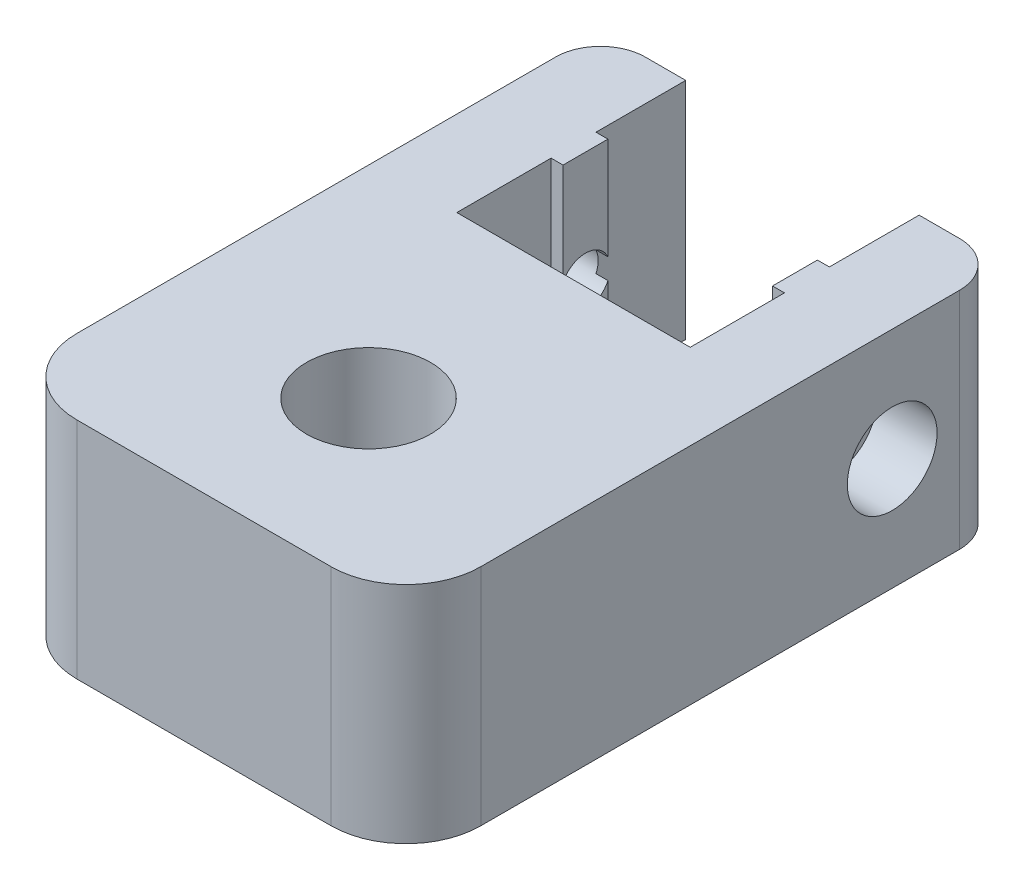
ISO-10303-21;
HEADER;
FILE_DESCRIPTION(('STEP AP214'),'2;1');
FILE_NAME('part.step','',(''),(''),'','','');
FILE_SCHEMA(('AUTOMOTIVE_DESIGN { 1 0 10303 214 1 1 1 1 }'));
ENDSEC;
DATA;
#1=APPLICATION_CONTEXT('core data for automotive mechanical design processes');
#2=APPLICATION_PROTOCOL_DEFINITION('international standard','automotive_design',2000,#1);
#3=PRODUCT_CONTEXT('',#1,'mechanical');
#4=PRODUCT('Part','Part','',(#3));
#5=PRODUCT_RELATED_PRODUCT_CATEGORY('part','',(#4));
#6=PRODUCT_DEFINITION_FORMATION('','',#4);
#7=PRODUCT_DEFINITION_CONTEXT('part definition',#1,'design');
#8=PRODUCT_DEFINITION('design','',#6,#7);
#9=PRODUCT_DEFINITION_SHAPE('','',#8);
#10=(LENGTH_UNIT() NAMED_UNIT(*) SI_UNIT(.MILLI.,.METRE.));
#11=(NAMED_UNIT(*) PLANE_ANGLE_UNIT() SI_UNIT($,.RADIAN.));
#12=(NAMED_UNIT(*) SI_UNIT($,.STERADIAN.) SOLID_ANGLE_UNIT());
#13=UNCERTAINTY_MEASURE_WITH_UNIT(LENGTH_MEASURE(1.E-05),#10,'distance_accuracy_value','');
#14=(GEOMETRIC_REPRESENTATION_CONTEXT(3) GLOBAL_UNCERTAINTY_ASSIGNED_CONTEXT((#13)) GLOBAL_UNIT_ASSIGNED_CONTEXT((#10,
#11,#12)) REPRESENTATION_CONTEXT('',''));
#15=CARTESIAN_POINT('',(0.,0.,0.));
#16=DIRECTION('',(0.,0.,1.));
#17=DIRECTION('',(1.,0.,0.));
#18=AXIS2_PLACEMENT_3D('',#15,#16,#17);
#19=CARTESIAN_POINT('',(64.,95.,79.5));
#20=DIRECTION('',(-1.,0.,0.));
#21=DIRECTION('',(0.,0.,1.));
#22=AXIS2_PLACEMENT_3D('',#19,#20,#21);
#23=PLANE('',#22);
#24=DIRECTION('',(0.,0.,1.));
#25=VECTOR('',#24,1.);
#26=CARTESIAN_POINT('',(64.,110.,79.5));
#27=LINE('',#26,#25);
#28=CARTESIAN_POINT('',(64.,110.,62.5));
#29=VERTEX_POINT('',#28);
#30=CARTESIAN_POINT('',(64.,110.,94.5));
#31=VERTEX_POINT('',#30);
#32=EDGE_CURVE('E398',#29,#31,#27,.T.);
#33=ORIENTED_EDGE('',*,*,#32,.F.);
#34=DIRECTION('',(0.,1.,0.));
#35=VECTOR('',#34,1.);
#36=CARTESIAN_POINT('',(64.,95.,62.5));
#37=LINE('',#36,#35);
#38=CARTESIAN_POINT('',(64.,95.,62.5));
#39=VERTEX_POINT('',#38);
#40=EDGE_CURVE('E363',#29,#39,#37,.F.);
#41=ORIENTED_EDGE('',*,*,#40,.T.);
#42=DIRECTION('',(0.,0.,1.));
#43=VECTOR('',#42,1.);
#44=CARTESIAN_POINT('',(64.,95.,79.5));
#45=LINE('',#44,#43);
#46=CARTESIAN_POINT('',(64.,95.,94.5));
#47=VERTEX_POINT('',#46);
#48=EDGE_CURVE('E503',#39,#47,#45,.T.);
#49=ORIENTED_EDGE('',*,*,#48,.T.);
#50=DIRECTION('',(0.,1.,0.));
#51=VECTOR('',#50,1.);
#52=CARTESIAN_POINT('',(64.,110.,94.5));
#53=LINE('',#52,#51);
#54=EDGE_CURVE('E324',#47,#31,#53,.T.);
#55=ORIENTED_EDGE('',*,*,#54,.T.);
#56=EDGE_LOOP('',(#33,#41,#49,#55));
#57=FACE_BOUND('',#56,.T.);
#58=CARTESIAN_POINT('',(64.,102.5,67.));
#59=DIRECTION('',(1.,0.,0.));
#60=DIRECTION('',(0.,0.,1.));
#61=AXIS2_PLACEMENT_3D('',#58,#59,#60);
#62=CIRCLE('',#61,3.);
#63=CARTESIAN_POINT('',(64.,102.5,70.));
#64=VERTEX_POINT('',#63);
#65=EDGE_CURVE('E743',#64,#64,#62,.T.);
#66=ORIENTED_EDGE('',*,*,#65,.T.);
#67=EDGE_LOOP('',(#66));
#68=FACE_BOUND('',#67,.T.);
#69=ADVANCED_FACE('F16',(#57,#68),#23,.T.);
#70=CARTESIAN_POINT('',(91.002,102.5,67.));
#71=DIRECTION('',(-1.,0.,0.));
#72=DIRECTION('',(0.,0.,1.));
#73=AXIS2_PLACEMENT_3D('',#70,#71,#72);
#74=CYLINDRICAL_SURFACE('',#73,1.65);
#75=CARTESIAN_POINT('',(69.7,102.5,67.));
#76=DIRECTION('',(-1.,0.,0.));
#77=DIRECTION('',(0.,0.,1.));
#78=AXIS2_PLACEMENT_3D('',#75,#76,#77);
#79=CIRCLE('',#78,1.65);
#80=CARTESIAN_POINT('',(69.7,103.187386354243,68.5));
#81=VERTEX_POINT('',#80);
#82=CARTESIAN_POINT('',(69.7,101.812613645757,68.5));
#83=VERTEX_POINT('',#82);
#84=EDGE_CURVE('E568',#81,#83,#79,.F.);
#85=ORIENTED_EDGE('',*,*,#84,.T.);
#86=DIRECTION('',(-1.,0.,0.));
#87=VECTOR('',#86,1.);
#88=CARTESIAN_POINT('',(91.002,101.812613645757,68.5));
#89=LINE('',#88,#87);
#90=CARTESIAN_POINT('',(70.5,101.812613645757,68.5));
#91=VERTEX_POINT('',#90);
#92=EDGE_CURVE('E565',#83,#91,#89,.F.);
#93=ORIENTED_EDGE('',*,*,#92,.T.);
#94=CARTESIAN_POINT('',(70.5,102.5,67.));
#95=DIRECTION('',(1.,0.,0.));
#96=DIRECTION('',(0.,0.,-1.));
#97=AXIS2_PLACEMENT_3D('',#94,#95,#96);
#98=CIRCLE('',#97,1.65);
#99=CARTESIAN_POINT('',(70.5,101.812613645757,65.5));
#100=VERTEX_POINT('',#99);
#101=EDGE_CURVE('E559',#100,#91,#98,.F.);
#102=ORIENTED_EDGE('',*,*,#101,.F.);
#103=DIRECTION('',(-1.,0.,0.));
#104=VECTOR('',#103,1.);
#105=CARTESIAN_POINT('',(91.002,101.812613645757,65.5));
#106=LINE('',#105,#104);
#107=CARTESIAN_POINT('',(69.7,101.812613645757,65.5));
#108=VERTEX_POINT('',#107);
#109=EDGE_CURVE('E268',#108,#100,#106,.F.);
#110=ORIENTED_EDGE('',*,*,#109,.F.);
#111=CARTESIAN_POINT('',(69.7,102.5,67.));
#112=DIRECTION('',(-1.,0.,0.));
#113=DIRECTION('',(0.,0.,1.));
#114=AXIS2_PLACEMENT_3D('',#111,#112,#113);
#115=CIRCLE('',#114,1.65);
#116=CARTESIAN_POINT('',(69.7,103.187386354243,65.5));
#117=VERTEX_POINT('',#116);
#118=EDGE_CURVE('E261',#108,#117,#115,.F.);
#119=ORIENTED_EDGE('',*,*,#118,.T.);
#120=DIRECTION('',(-1.,0.,0.));
#121=VECTOR('',#120,1.);
#122=CARTESIAN_POINT('',(91.002,103.187386354243,65.5));
#123=LINE('',#122,#121);
#124=CARTESIAN_POINT('',(70.5,103.187386354243,65.5));
#125=VERTEX_POINT('',#124);
#126=EDGE_CURVE('E265',#125,#117,#123,.T.);
#127=ORIENTED_EDGE('',*,*,#126,.F.);
#128=CARTESIAN_POINT('',(70.5,103.187386354243,68.5));
#129=VERTEX_POINT('',#128);
#130=EDGE_CURVE('E555',#129,#125,#98,.F.);
#131=ORIENTED_EDGE('',*,*,#130,.F.);
#132=DIRECTION('',(-1.,0.,0.));
#133=VECTOR('',#132,1.);
#134=CARTESIAN_POINT('',(91.002,103.187386354243,68.5));
#135=LINE('',#134,#133);
#136=EDGE_CURVE('E562',#129,#81,#135,.T.);
#137=ORIENTED_EDGE('',*,*,#136,.T.);
#138=EDGE_LOOP('',(#85,#93,#102,#110,#119,#127,#131,#137));
#139=FACE_BOUND('',#138,.T.);
#140=CARTESIAN_POINT('',(66.,102.5,67.));
#141=DIRECTION('',(1.,0.,0.));
#142=DIRECTION('',(0.,0.,1.));
#143=AXIS2_PLACEMENT_3D('',#140,#141,#142);
#144=CIRCLE('',#143,1.65);
#145=CARTESIAN_POINT('',(66.,102.5,68.65));
#146=VERTEX_POINT('',#145);
#147=EDGE_CURVE('E728',#146,#146,#144,.T.);
#148=ORIENTED_EDGE('',*,*,#147,.F.);
#149=EDGE_LOOP('',(#148));
#150=FACE_BOUND('',#149,.T.);
#151=ADVANCED_FACE('F263',(#139,#150),#74,.F.);
#152=DIRECTION('',(-1.,0.,0.));
#153=VECTOR('',#152,1.);
#154=CARTESIAN_POINT('',(91.002,101.812613645757,65.5));
#155=LINE('',#154,#153);
#156=CARTESIAN_POINT('',(84.5,101.812613645757,65.5));
#157=VERTEX_POINT('',#156);
#158=CARTESIAN_POINT('',(85.3,101.812613645757,65.5));
#159=VERTEX_POINT('',#158);
#160=EDGE_CURVE('E587',#157,#159,#155,.F.);
#161=ORIENTED_EDGE('',*,*,#160,.F.);
#162=CARTESIAN_POINT('',(84.5,102.5,67.));
#163=DIRECTION('',(1.,0.,0.));
#164=DIRECTION('',(0.,0.,-1.));
#165=AXIS2_PLACEMENT_3D('',#162,#163,#164);
#166=CIRCLE('',#165,1.65);
#167=CARTESIAN_POINT('',(84.5,101.812613645757,68.5));
#168=VERTEX_POINT('',#167);
#169=EDGE_CURVE('E584',#157,#168,#166,.F.);
#170=ORIENTED_EDGE('',*,*,#169,.T.);
#171=DIRECTION('',(-1.,0.,0.));
#172=VECTOR('',#171,1.);
#173=CARTESIAN_POINT('',(91.002,101.812613645757,68.5));
#174=LINE('',#173,#172);
#175=CARTESIAN_POINT('',(85.3,101.812613645757,68.5));
#176=VERTEX_POINT('',#175);
#177=EDGE_CURVE('E578',#168,#176,#174,.F.);
#178=ORIENTED_EDGE('',*,*,#177,.T.);
#179=CARTESIAN_POINT('',(85.3,102.5,67.));
#180=DIRECTION('',(-1.,0.,0.));
#181=DIRECTION('',(0.,0.,1.));
#182=AXIS2_PLACEMENT_3D('',#179,#180,#181);
#183=CIRCLE('',#182,1.65);
#184=CARTESIAN_POINT('',(85.3,103.187386354243,68.5));
#185=VERTEX_POINT('',#184);
#186=EDGE_CURVE('E571',#185,#176,#183,.F.);
#187=ORIENTED_EDGE('',*,*,#186,.F.);
#188=DIRECTION('',(-1.,0.,0.));
#189=VECTOR('',#188,1.);
#190=CARTESIAN_POINT('',(91.002,103.187386354243,68.5));
#191=LINE('',#190,#189);
#192=CARTESIAN_POINT('',(84.5,103.187386354243,68.5));
#193=VERTEX_POINT('',#192);
#194=EDGE_CURVE('E575',#185,#193,#191,.T.);
#195=ORIENTED_EDGE('',*,*,#194,.T.);
#196=CARTESIAN_POINT('',(84.5,103.187386354243,65.5));
#197=VERTEX_POINT('',#196);
#198=EDGE_CURVE('E581',#193,#197,#166,.F.);
#199=ORIENTED_EDGE('',*,*,#198,.T.);
#200=DIRECTION('',(-1.,0.,0.));
#201=VECTOR('',#200,1.);
#202=CARTESIAN_POINT('',(91.002,103.187386354243,65.5));
#203=LINE('',#202,#201);
#204=CARTESIAN_POINT('',(85.3,103.187386354243,65.5));
#205=VERTEX_POINT('',#204);
#206=EDGE_CURVE('E452',#205,#197,#203,.T.);
#207=ORIENTED_EDGE('',*,*,#206,.F.);
#208=CARTESIAN_POINT('',(85.3,102.5,67.));
#209=DIRECTION('',(-1.,0.,0.));
#210=DIRECTION('',(0.,0.,1.));
#211=AXIS2_PLACEMENT_3D('',#208,#209,#210);
#212=CIRCLE('',#211,1.65);
#213=EDGE_CURVE('E474',#159,#205,#212,.F.);
#214=ORIENTED_EDGE('',*,*,#213,.F.);
#215=EDGE_LOOP('',(#161,#170,#178,#187,#195,#199,#207,#214));
#216=FACE_BOUND('',#215,.T.);
#217=CARTESIAN_POINT('',(87.,102.5,67.));
#218=DIRECTION('',(1.,0.,0.));
#219=DIRECTION('',(0.,0.,-1.));
#220=AXIS2_PLACEMENT_3D('',#217,#218,#219);
#221=CIRCLE('',#220,1.65);
#222=CARTESIAN_POINT('',(87.,102.5,65.35));
#223=VERTEX_POINT('',#222);
#224=EDGE_CURVE('E727',#223,#223,#221,.T.);
#225=ORIENTED_EDGE('',*,*,#224,.T.);
#226=EDGE_LOOP('',(#225));
#227=FACE_BOUND('',#226,.T.);
#228=ADVANCED_FACE('F635',(#216,#227),#74,.F.);
#229=CARTESIAN_POINT('',(84.75,95.,65.5));
#230=DIRECTION('',(0.,0.,-1.));
#231=DIRECTION('',(-1.,0.,0.));
#232=AXIS2_PLACEMENT_3D('',#229,#230,#231);
#233=PLANE('',#232);
#234=DIRECTION('',(0.,1.,0.));
#235=VECTOR('',#234,1.);
#236=CARTESIAN_POINT('',(84.5,95.,65.5));
#237=LINE('',#236,#235);
#238=CARTESIAN_POINT('',(84.5,95.,65.5));
#239=VERTEX_POINT('',#238);
#240=EDGE_CURVE('E434',#239,#157,#237,.T.);
#241=ORIENTED_EDGE('',*,*,#240,.T.);
#242=ORIENTED_EDGE('',*,*,#160,.T.);
#243=DIRECTION('',(0.,1.,0.));
#244=VECTOR('',#243,1.);
#245=CARTESIAN_POINT('',(85.3,95.,65.5));
#246=LINE('',#245,#244);
#247=CARTESIAN_POINT('',(85.3,95.,65.5));
#248=VERTEX_POINT('',#247);
#249=EDGE_CURVE('E317',#248,#159,#246,.T.);
#250=ORIENTED_EDGE('',*,*,#249,.F.);
#251=DIRECTION('',(-1.,0.,0.));
#252=VECTOR('',#251,1.);
#253=CARTESIAN_POINT('',(84.75,95.,65.5));
#254=LINE('',#253,#252);
#255=EDGE_CURVE('E525',#248,#239,#254,.T.);
#256=ORIENTED_EDGE('',*,*,#255,.T.);
#257=EDGE_LOOP('',(#241,#242,#250,#256));
#258=FACE_BOUND('',#257,.T.);
#259=ADVANCED_FACE('F690',(#258),#233,.T.);
#260=CARTESIAN_POINT('',(85.3,110.,65.5));
#261=VERTEX_POINT('',#260);
#262=EDGE_CURVE('E321',#205,#261,#246,.T.);
#263=ORIENTED_EDGE('',*,*,#262,.F.);
#264=ORIENTED_EDGE('',*,*,#206,.T.);
#265=CARTESIAN_POINT('',(84.5,110.,65.5));
#266=VERTEX_POINT('',#265);
#267=EDGE_CURVE('E433',#197,#266,#237,.T.);
#268=ORIENTED_EDGE('',*,*,#267,.T.);
#269=DIRECTION('',(-1.,0.,0.));
#270=VECTOR('',#269,1.);
#271=CARTESIAN_POINT('',(84.75,110.,65.5));
#272=LINE('',#271,#270);
#273=EDGE_CURVE('E394',#261,#266,#272,.T.);
#274=ORIENTED_EDGE('',*,*,#273,.F.);
#275=EDGE_LOOP('',(#263,#264,#268,#274));
#276=FACE_BOUND('',#275,.T.);
#277=ADVANCED_FACE('F450',(#276),#233,.T.);
#278=CARTESIAN_POINT('',(84.5,95.,67.));
#279=DIRECTION('',(1.,0.,0.));
#280=DIRECTION('',(0.,0.,-1.));
#281=AXIS2_PLACEMENT_3D('',#278,#279,#280);
#282=PLANE('',#281);
#283=ORIENTED_EDGE('',*,*,#169,.F.);
#284=ORIENTED_EDGE('',*,*,#240,.F.);
#285=DIRECTION('',(0.,0.,-1.));
#286=VECTOR('',#285,1.);
#287=CARTESIAN_POINT('',(84.5,95.,67.));
#288=LINE('',#287,#286);
#289=CARTESIAN_POINT('',(84.5,95.,68.5));
#290=VERTEX_POINT('',#289);
#291=EDGE_CURVE('E528',#290,#239,#288,.T.);
#292=ORIENTED_EDGE('',*,*,#291,.F.);
#293=DIRECTION('',(0.,1.,0.));
#294=VECTOR('',#293,1.);
#295=CARTESIAN_POINT('',(84.5,95.,68.5));
#296=LINE('',#295,#294);
#297=EDGE_CURVE('E430',#290,#168,#296,.T.);
#298=ORIENTED_EDGE('',*,*,#297,.T.);
#299=EDGE_LOOP('',(#283,#284,#292,#298));
#300=FACE_BOUND('',#299,.T.);
#301=ADVANCED_FACE('F711',(#300),#282,.F.);
#302=CARTESIAN_POINT('',(84.75,95.,68.5));
#303=DIRECTION('',(0.,0.,-1.));
#304=DIRECTION('',(-1.,0.,0.));
#305=AXIS2_PLACEMENT_3D('',#302,#303,#304);
#306=PLANE('',#305);
#307=ORIENTED_EDGE('',*,*,#177,.F.);
#308=ORIENTED_EDGE('',*,*,#297,.F.);
#309=DIRECTION('',(-1.,0.,0.));
#310=VECTOR('',#309,1.);
#311=CARTESIAN_POINT('',(84.75,95.,68.5));
#312=LINE('',#311,#310);
#313=CARTESIAN_POINT('',(85.3,95.,68.5));
#314=VERTEX_POINT('',#313);
#315=EDGE_CURVE('E518',#314,#290,#312,.T.);
#316=ORIENTED_EDGE('',*,*,#315,.F.);
#317=DIRECTION('',(0.,1.,0.));
#318=VECTOR('',#317,1.);
#319=CARTESIAN_POINT('',(85.3,95.,68.5));
#320=LINE('',#319,#318);
#321=EDGE_CURVE('E312',#314,#176,#320,.T.);
#322=ORIENTED_EDGE('',*,*,#321,.T.);
#323=EDGE_LOOP('',(#307,#308,#316,#322));
#324=FACE_BOUND('',#323,.T.);
#325=ADVANCED_FACE('F714',(#324),#306,.F.);
#326=ORIENTED_EDGE('',*,*,#194,.F.);
#327=CARTESIAN_POINT('',(85.3,110.,68.5));
#328=VERTEX_POINT('',#327);
#329=EDGE_CURVE('E311',#185,#328,#320,.T.);
#330=ORIENTED_EDGE('',*,*,#329,.T.);
#331=DIRECTION('',(-1.,0.,0.));
#332=VECTOR('',#331,1.);
#333=CARTESIAN_POINT('',(84.75,110.,68.5));
#334=LINE('',#333,#332);
#335=CARTESIAN_POINT('',(84.5,110.,68.5));
#336=VERTEX_POINT('',#335);
#337=EDGE_CURVE('E387',#328,#336,#334,.T.);
#338=ORIENTED_EDGE('',*,*,#337,.T.);
#339=EDGE_CURVE('E316',#193,#336,#296,.T.);
#340=ORIENTED_EDGE('',*,*,#339,.F.);
#341=EDGE_LOOP('',(#326,#330,#338,#340));
#342=FACE_BOUND('',#341,.T.);
#343=ADVANCED_FACE('F705',(#342),#306,.F.);
#344=CARTESIAN_POINT('',(69.85,95.,68.5));
#345=DIRECTION('',(0.,0.,-1.));
#346=DIRECTION('',(-1.,0.,0.));
#347=AXIS2_PLACEMENT_3D('',#344,#345,#346);
#348=PLANE('',#347);
#349=ORIENTED_EDGE('',*,*,#92,.F.);
#350=DIRECTION('',(0.,1.,0.));
#351=VECTOR('',#350,1.);
#352=CARTESIAN_POINT('',(69.7,95.,68.5));
#353=LINE('',#352,#351);
#354=CARTESIAN_POINT('',(69.7,95.,68.5));
#355=VERTEX_POINT('',#354);
#356=EDGE_CURVE('E300',#355,#83,#353,.T.);
#357=ORIENTED_EDGE('',*,*,#356,.F.);
#358=DIRECTION('',(-1.,0.,0.));
#359=VECTOR('',#358,1.);
#360=CARTESIAN_POINT('',(69.85,95.,68.5));
#361=LINE('',#360,#359);
#362=CARTESIAN_POINT('',(70.5,95.,68.5));
#363=VERTEX_POINT('',#362);
#364=EDGE_CURVE('E536',#363,#355,#361,.T.);
#365=ORIENTED_EDGE('',*,*,#364,.F.);
#366=DIRECTION('',(0.,1.,0.));
#367=VECTOR('',#366,1.);
#368=CARTESIAN_POINT('',(70.5,95.,68.5));
#369=LINE('',#368,#367);
#370=EDGE_CURVE('E426',#363,#91,#369,.T.);
#371=ORIENTED_EDGE('',*,*,#370,.T.);
#372=EDGE_LOOP('',(#349,#357,#365,#371));
#373=FACE_BOUND('',#372,.T.);
#374=ADVANCED_FACE('F701',(#373),#348,.F.);
#375=ORIENTED_EDGE('',*,*,#136,.F.);
#376=CARTESIAN_POINT('',(70.5,110.,68.5));
#377=VERTEX_POINT('',#376);
#378=EDGE_CURVE('E425',#129,#377,#369,.T.);
#379=ORIENTED_EDGE('',*,*,#378,.T.);
#380=DIRECTION('',(-1.,0.,0.));
#381=VECTOR('',#380,1.);
#382=CARTESIAN_POINT('',(69.85,110.,68.5));
#383=LINE('',#382,#381);
#384=CARTESIAN_POINT('',(69.7,110.,68.5));
#385=VERTEX_POINT('',#384);
#386=EDGE_CURVE('E412',#377,#385,#383,.T.);
#387=ORIENTED_EDGE('',*,*,#386,.T.);
#388=EDGE_CURVE('E305',#81,#385,#353,.T.);
#389=ORIENTED_EDGE('',*,*,#388,.F.);
#390=EDGE_LOOP('',(#375,#379,#387,#389));
#391=FACE_BOUND('',#390,.T.);
#392=ADVANCED_FACE('F704',(#391),#348,.F.);
#393=CARTESIAN_POINT('',(70.5,95.,67.));
#394=DIRECTION('',(1.,0.,0.));
#395=DIRECTION('',(0.,0.,-1.));
#396=AXIS2_PLACEMENT_3D('',#393,#394,#395);
#397=PLANE('',#396);
#398=DIRECTION('',(0.,1.,0.));
#399=VECTOR('',#398,1.);
#400=CARTESIAN_POINT('',(70.5,95.,65.5));
#401=LINE('',#400,#399);
#402=CARTESIAN_POINT('',(70.5,95.,65.5));
#403=VERTEX_POINT('',#402);
#404=EDGE_CURVE('E421',#403,#100,#401,.T.);
#405=ORIENTED_EDGE('',*,*,#404,.T.);
#406=ORIENTED_EDGE('',*,*,#101,.T.);
#407=ORIENTED_EDGE('',*,*,#370,.F.);
#408=DIRECTION('',(0.,0.,-1.));
#409=VECTOR('',#408,1.);
#410=CARTESIAN_POINT('',(70.5,95.,67.));
#411=LINE('',#410,#409);
#412=EDGE_CURVE('E296',#363,#403,#411,.T.);
#413=ORIENTED_EDGE('',*,*,#412,.T.);
#414=EDGE_LOOP('',(#405,#406,#407,#413));
#415=FACE_BOUND('',#414,.T.);
#416=ADVANCED_FACE('F545',(#415),#397,.T.);
#417=CARTESIAN_POINT('',(69.85,95.,65.5));
#418=DIRECTION('',(0.,0.,-1.));
#419=DIRECTION('',(-1.,0.,0.));
#420=AXIS2_PLACEMENT_3D('',#417,#418,#419);
#421=PLANE('',#420);
#422=DIRECTION('',(0.,1.,0.));
#423=VECTOR('',#422,1.);
#424=CARTESIAN_POINT('',(69.7,95.,65.5));
#425=LINE('',#424,#423);
#426=CARTESIAN_POINT('',(69.7,95.,65.5));
#427=VERTEX_POINT('',#426);
#428=EDGE_CURVE('E289',#427,#108,#425,.T.);
#429=ORIENTED_EDGE('',*,*,#428,.T.);
#430=ORIENTED_EDGE('',*,*,#109,.T.);
#431=ORIENTED_EDGE('',*,*,#404,.F.);
#432=DIRECTION('',(-1.,0.,0.));
#433=VECTOR('',#432,1.);
#434=CARTESIAN_POINT('',(69.85,95.,65.5));
#435=LINE('',#434,#433);
#436=EDGE_CURVE('E532',#403,#427,#435,.T.);
#437=ORIENTED_EDGE('',*,*,#436,.T.);
#438=EDGE_LOOP('',(#429,#430,#431,#437));
#439=FACE_BOUND('',#438,.T.);
#440=ADVANCED_FACE('F553',(#439),#421,.T.);
#441=CARTESIAN_POINT('',(70.5,110.,65.5));
#442=VERTEX_POINT('',#441);
#443=EDGE_CURVE('E281',#125,#442,#401,.T.);
#444=ORIENTED_EDGE('',*,*,#443,.F.);
#445=ORIENTED_EDGE('',*,*,#126,.T.);
#446=CARTESIAN_POINT('',(69.7,110.,65.5));
#447=VERTEX_POINT('',#446);
#448=EDGE_CURVE('E279',#117,#447,#425,.T.);
#449=ORIENTED_EDGE('',*,*,#448,.T.);
#450=DIRECTION('',(-1.,0.,0.));
#451=VECTOR('',#450,1.);
#452=CARTESIAN_POINT('',(69.85,110.,65.5));
#453=LINE('',#452,#451);
#454=EDGE_CURVE('E409',#442,#447,#453,.T.);
#455=ORIENTED_EDGE('',*,*,#454,.F.);
#456=EDGE_LOOP('',(#444,#445,#449,#455));
#457=FACE_BOUND('',#456,.T.);
#458=ADVANCED_FACE('F277',(#457),#421,.T.);
#459=CARTESIAN_POINT('',(88.15,95.,59.5));
#460=DIRECTION('',(0.,0.,1.));
#461=DIRECTION('',(1.,0.,0.));
#462=AXIS2_PLACEMENT_3D('',#459,#460,#461);
#463=PLANE('',#462);
#464=DIRECTION('',(1.,0.,0.));
#465=VECTOR('',#464,1.);
#466=CARTESIAN_POINT('',(88.15,110.,59.5));
#467=LINE('',#466,#465);
#468=CARTESIAN_POINT('',(85.3,110.,59.5));
#469=VERTEX_POINT('',#468);
#470=CARTESIAN_POINT('',(88.,110.,59.5));
#471=VERTEX_POINT('',#470);
#472=EDGE_CURVE('E461',#469,#471,#467,.T.);
#473=ORIENTED_EDGE('',*,*,#472,.T.);
#474=DIRECTION('',(0.,1.,0.));
#475=VECTOR('',#474,1.);
#476=CARTESIAN_POINT('',(88.,95.,59.5));
#477=LINE('',#476,#475);
#478=CARTESIAN_POINT('',(88.,95.,59.5));
#479=VERTEX_POINT('',#478);
#480=EDGE_CURVE('E10',#471,#479,#477,.F.);
#481=ORIENTED_EDGE('',*,*,#480,.T.);
#482=DIRECTION('',(1.,0.,0.));
#483=VECTOR('',#482,1.);
#484=CARTESIAN_POINT('',(88.15,95.,59.5));
#485=LINE('',#484,#483);
#486=CARTESIAN_POINT('',(85.3,95.,59.5));
#487=VERTEX_POINT('',#486);
#488=EDGE_CURVE('E420',#487,#479,#485,.T.);
#489=ORIENTED_EDGE('',*,*,#488,.F.);
#490=DIRECTION('',(0.,1.,0.));
#491=VECTOR('',#490,1.);
#492=CARTESIAN_POINT('',(85.3,95.,59.5));
#493=LINE('',#492,#491);
#494=EDGE_CURVE('E320',#487,#469,#493,.T.);
#495=ORIENTED_EDGE('',*,*,#494,.T.);
#496=EDGE_LOOP('',(#473,#481,#489,#495));
#497=FACE_BOUND('',#496,.T.);
#498=ADVANCED_FACE('F661',(#497),#463,.F.);
#499=CARTESIAN_POINT('',(85.3,95.,62.5));
#500=DIRECTION('',(-1.,0.,0.));
#501=DIRECTION('',(0.,0.,1.));
#502=AXIS2_PLACEMENT_3D('',#499,#500,#501);
#503=PLANE('',#502);
#504=ORIENTED_EDGE('',*,*,#249,.T.);
#505=ORIENTED_EDGE('',*,*,#213,.T.);
#506=ORIENTED_EDGE('',*,*,#262,.T.);
#507=DIRECTION('',(0.,0.,1.));
#508=VECTOR('',#507,1.);
#509=CARTESIAN_POINT('',(85.3,110.,62.5));
#510=LINE('',#509,#508);
#511=EDGE_CURVE('E460',#469,#261,#510,.T.);
#512=ORIENTED_EDGE('',*,*,#511,.F.);
#513=ORIENTED_EDGE('',*,*,#494,.F.);
#514=DIRECTION('',(0.,0.,1.));
#515=VECTOR('',#514,1.);
#516=CARTESIAN_POINT('',(85.3,95.,62.5));
#517=LINE('',#516,#515);
#518=EDGE_CURVE('E595',#487,#248,#517,.T.);
#519=ORIENTED_EDGE('',*,*,#518,.T.);
#520=EDGE_LOOP('',(#504,#505,#506,#512,#513,#519));
#521=FACE_BOUND('',#520,.T.);
#522=ADVANCED_FACE('F658',(#521),#503,.T.);
#523=ORIENTED_EDGE('',*,*,#198,.F.);
#524=ORIENTED_EDGE('',*,*,#339,.T.);
#525=DIRECTION('',(0.,0.,-1.));
#526=VECTOR('',#525,1.);
#527=CARTESIAN_POINT('',(84.5,110.,67.));
#528=LINE('',#527,#526);
#529=EDGE_CURVE('E405',#336,#266,#528,.T.);
#530=ORIENTED_EDGE('',*,*,#529,.T.);
#531=ORIENTED_EDGE('',*,*,#267,.F.);
#532=EDGE_LOOP('',(#523,#524,#530,#531));
#533=FACE_BOUND('',#532,.T.);
#534=ADVANCED_FACE('F456',(#533),#282,.F.);
#535=CARTESIAN_POINT('',(85.3,95.,71.65));
#536=DIRECTION('',(-1.,0.,0.));
#537=DIRECTION('',(0.,0.,1.));
#538=AXIS2_PLACEMENT_3D('',#535,#536,#537);
#539=PLANE('',#538);
#540=ORIENTED_EDGE('',*,*,#329,.F.);
#541=ORIENTED_EDGE('',*,*,#186,.T.);
#542=ORIENTED_EDGE('',*,*,#321,.F.);
#543=DIRECTION('',(0.,0.,1.));
#544=VECTOR('',#543,1.);
#545=CARTESIAN_POINT('',(85.3,95.,71.65));
#546=LINE('',#545,#544);
#547=CARTESIAN_POINT('',(85.3,95.,74.8));
#548=VERTEX_POINT('',#547);
#549=EDGE_CURVE('E598',#314,#548,#546,.T.);
#550=ORIENTED_EDGE('',*,*,#549,.T.);
#551=DIRECTION('',(0.,1.,0.));
#552=VECTOR('',#551,1.);
#553=CARTESIAN_POINT('',(85.3,95.,74.8));
#554=LINE('',#553,#552);
#555=CARTESIAN_POINT('',(85.3,110.,74.8));
#556=VERTEX_POINT('',#555);
#557=EDGE_CURVE('E308',#548,#556,#554,.T.);
#558=ORIENTED_EDGE('',*,*,#557,.T.);
#559=DIRECTION('',(0.,0.,1.));
#560=VECTOR('',#559,1.);
#561=CARTESIAN_POINT('',(85.3,110.,71.65));
#562=LINE('',#561,#560);
#563=EDGE_CURVE('E464',#328,#556,#562,.T.);
#564=ORIENTED_EDGE('',*,*,#563,.F.);
#565=EDGE_LOOP('',(#540,#541,#542,#550,#558,#564));
#566=FACE_BOUND('',#565,.T.);
#567=ADVANCED_FACE('F653',(#566),#539,.T.);
#568=CARTESIAN_POINT('',(77.5,95.,74.8));
#569=DIRECTION('',(0.,0.,-1.));
#570=DIRECTION('',(-1.,0.,0.));
#571=AXIS2_PLACEMENT_3D('',#568,#569,#570);
#572=PLANE('',#571);
#573=DIRECTION('',(-1.,0.,0.));
#574=VECTOR('',#573,1.);
#575=CARTESIAN_POINT('',(77.5,110.,74.8));
#576=LINE('',#575,#574);
#577=CARTESIAN_POINT('',(69.7,110.,74.8));
#578=VERTEX_POINT('',#577);
#579=EDGE_CURVE('E471',#556,#578,#576,.T.);
#580=ORIENTED_EDGE('',*,*,#579,.F.);
#581=ORIENTED_EDGE('',*,*,#557,.F.);
#582=DIRECTION('',(-1.,0.,0.));
#583=VECTOR('',#582,1.);
#584=CARTESIAN_POINT('',(77.5,95.,74.8));
#585=LINE('',#584,#583);
#586=CARTESIAN_POINT('',(69.7,95.,74.8));
#587=VERTEX_POINT('',#586);
#588=EDGE_CURVE('E601',#548,#587,#585,.T.);
#589=ORIENTED_EDGE('',*,*,#588,.T.);
#590=DIRECTION('',(0.,1.,0.));
#591=VECTOR('',#590,1.);
#592=CARTESIAN_POINT('',(69.7,95.,74.8));
#593=LINE('',#592,#591);
#594=EDGE_CURVE('E304',#587,#578,#593,.T.);
#595=ORIENTED_EDGE('',*,*,#594,.T.);
#596=EDGE_LOOP('',(#580,#581,#589,#595));
#597=FACE_BOUND('',#596,.T.);
#598=ADVANCED_FACE('F649',(#597),#572,.T.);
#599=CARTESIAN_POINT('',(69.7,95.,71.65));
#600=DIRECTION('',(-1.,0.,0.));
#601=DIRECTION('',(0.,0.,1.));
#602=AXIS2_PLACEMENT_3D('',#599,#600,#601);
#603=PLANE('',#602);
#604=ORIENTED_EDGE('',*,*,#84,.F.);
#605=ORIENTED_EDGE('',*,*,#388,.T.);
#606=DIRECTION('',(0.,0.,1.));
#607=VECTOR('',#606,1.);
#608=CARTESIAN_POINT('',(69.7,110.,71.65));
#609=LINE('',#608,#607);
#610=EDGE_CURVE('E481',#385,#578,#609,.T.);
#611=ORIENTED_EDGE('',*,*,#610,.T.);
#612=ORIENTED_EDGE('',*,*,#594,.F.);
#613=DIRECTION('',(0.,0.,1.));
#614=VECTOR('',#613,1.);
#615=CARTESIAN_POINT('',(69.7,95.,71.65));
#616=LINE('',#615,#614);
#617=EDGE_CURVE('E605',#355,#587,#616,.T.);
#618=ORIENTED_EDGE('',*,*,#617,.F.);
#619=ORIENTED_EDGE('',*,*,#356,.T.);
#620=EDGE_LOOP('',(#604,#605,#611,#612,#618,#619));
#621=FACE_BOUND('',#620,.T.);
#622=ADVANCED_FACE('F646',(#621),#603,.F.);
#623=ORIENTED_EDGE('',*,*,#378,.F.);
#624=ORIENTED_EDGE('',*,*,#130,.T.);
#625=ORIENTED_EDGE('',*,*,#443,.T.);
#626=DIRECTION('',(0.,0.,-1.));
#627=VECTOR('',#626,1.);
#628=CARTESIAN_POINT('',(70.5,110.,67.));
#629=LINE('',#628,#627);
#630=EDGE_CURVE('E416',#377,#442,#629,.T.);
#631=ORIENTED_EDGE('',*,*,#630,.F.);
#632=EDGE_LOOP('',(#623,#624,#625,#631));
#633=FACE_BOUND('',#632,.T.);
#634=ADVANCED_FACE('F645',(#633),#397,.T.);
#635=CARTESIAN_POINT('',(69.7,95.,62.5));
#636=DIRECTION('',(-1.,0.,0.));
#637=DIRECTION('',(0.,0.,1.));
#638=AXIS2_PLACEMENT_3D('',#635,#636,#637);
#639=PLANE('',#638);
#640=ORIENTED_EDGE('',*,*,#118,.F.);
#641=ORIENTED_EDGE('',*,*,#428,.F.);
#642=DIRECTION('',(0.,0.,1.));
#643=VECTOR('',#642,1.);
#644=CARTESIAN_POINT('',(69.7,95.,62.5));
#645=LINE('',#644,#643);
#646=CARTESIAN_POINT('',(69.7,95.,59.5));
#647=VERTEX_POINT('',#646);
#648=EDGE_CURVE('E551',#647,#427,#645,.T.);
#649=ORIENTED_EDGE('',*,*,#648,.F.);
#650=DIRECTION('',(0.,1.,0.));
#651=VECTOR('',#650,1.);
#652=CARTESIAN_POINT('',(69.7,95.,59.5));
#653=LINE('',#652,#651);
#654=CARTESIAN_POINT('',(69.7,110.,59.5));
#655=VERTEX_POINT('',#654);
#656=EDGE_CURVE('E290',#647,#655,#653,.T.);
#657=ORIENTED_EDGE('',*,*,#656,.T.);
#658=DIRECTION('',(0.,0.,1.));
#659=VECTOR('',#658,1.);
#660=CARTESIAN_POINT('',(69.7,110.,62.5));
#661=LINE('',#660,#659);
#662=EDGE_CURVE('E286',#655,#447,#661,.T.);
#663=ORIENTED_EDGE('',*,*,#662,.T.);
#664=ORIENTED_EDGE('',*,*,#448,.F.);
#665=EDGE_LOOP('',(#640,#641,#649,#657,#663,#664));
#666=FACE_BOUND('',#665,.T.);
#667=ADVANCED_FACE('F284',(#666),#639,.F.);
#668=CARTESIAN_POINT('',(66.85,95.,59.5));
#669=DIRECTION('',(0.,0.,-1.));
#670=DIRECTION('',(-1.,0.,0.));
#671=AXIS2_PLACEMENT_3D('',#668,#669,#670);
#672=PLANE('',#671);
#673=DIRECTION('',(-1.,0.,0.));
#674=VECTOR('',#673,1.);
#675=CARTESIAN_POINT('',(66.85,95.,59.5));
#676=LINE('',#675,#674);
#677=CARTESIAN_POINT('',(67.,95.,59.5));
#678=VERTEX_POINT('',#677);
#679=EDGE_CURVE('E506',#647,#678,#676,.T.);
#680=ORIENTED_EDGE('',*,*,#679,.T.);
#681=DIRECTION('',(0.,1.,0.));
#682=VECTOR('',#681,1.);
#683=CARTESIAN_POINT('',(67.,95.,59.5));
#684=LINE('',#683,#682);
#685=CARTESIAN_POINT('',(67.,110.,59.5));
#686=VERTEX_POINT('',#685);
#687=EDGE_CURVE('E353',#678,#686,#684,.T.);
#688=ORIENTED_EDGE('',*,*,#687,.T.);
#689=DIRECTION('',(-1.,0.,0.));
#690=VECTOR('',#689,1.);
#691=CARTESIAN_POINT('',(66.85,110.,59.5));
#692=LINE('',#691,#690);
#693=EDGE_CURVE('E487',#655,#686,#692,.T.);
#694=ORIENTED_EDGE('',*,*,#693,.F.);
#695=ORIENTED_EDGE('',*,*,#656,.F.);
#696=EDGE_LOOP('',(#680,#688,#694,#695));
#697=FACE_BOUND('',#696,.T.);
#698=ADVANCED_FACE('F616',(#697),#672,.T.);
#699=CARTESIAN_POINT('',(67.,95.,99.5));
#700=DIRECTION('',(0.,0.,-1.));
#701=DIRECTION('',(-1.,0.,0.));
#702=AXIS2_PLACEMENT_3D('',#699,#700,#701);
#703=PLANE('',#702);
#704=DIRECTION('',(-1.,0.,0.));
#705=VECTOR('',#704,1.);
#706=CARTESIAN_POINT('',(67.,110.,99.5));
#707=LINE('',#706,#705);
#708=CARTESIAN_POINT('',(86.,110.,99.5));
#709=VERTEX_POINT('',#708);
#710=CARTESIAN_POINT('',(69.,110.,99.5));
#711=VERTEX_POINT('',#710);
#712=EDGE_CURVE('E388',#709,#711,#707,.T.);
#713=ORIENTED_EDGE('',*,*,#712,.T.);
#714=DIRECTION('',(0.,1.,0.));
#715=VECTOR('',#714,1.);
#716=CARTESIAN_POINT('',(69.,95.,99.5));
#717=LINE('',#716,#715);
#718=CARTESIAN_POINT('',(69.,95.,99.5));
#719=VERTEX_POINT('',#718);
#720=EDGE_CURVE('E339',#711,#719,#717,.F.);
#721=ORIENTED_EDGE('',*,*,#720,.T.);
#722=DIRECTION('',(-1.,0.,0.));
#723=VECTOR('',#722,1.);
#724=CARTESIAN_POINT('',(67.,95.,99.5));
#725=LINE('',#724,#723);
#726=CARTESIAN_POINT('',(86.,95.,99.5));
#727=VERTEX_POINT('',#726);
#728=EDGE_CURVE('E505',#727,#719,#725,.T.);
#729=ORIENTED_EDGE('',*,*,#728,.F.);
#730=DIRECTION('',(0.,1.,0.));
#731=VECTOR('',#730,1.);
#732=CARTESIAN_POINT('',(86.,95.,99.5));
#733=LINE('',#732,#731);
#734=EDGE_CURVE('E335',#727,#709,#733,.T.);
#735=ORIENTED_EDGE('',*,*,#734,.T.);
#736=EDGE_LOOP('',(#713,#721,#729,#735));
#737=FACE_BOUND('',#736,.T.);
#738=ADVANCED_FACE('F639',(#737),#703,.F.);
#739=CARTESIAN_POINT('',(91.,95.,79.5));
#740=DIRECTION('',(-1.,0.,0.));
#741=DIRECTION('',(0.,0.,1.));
#742=AXIS2_PLACEMENT_3D('',#739,#740,#741);
#743=PLANE('',#742);
#744=CARTESIAN_POINT('',(91.,102.5,67.));
#745=DIRECTION('',(1.,0.,0.));
#746=DIRECTION('',(0.,0.,-1.));
#747=AXIS2_PLACEMENT_3D('',#744,#745,#746);
#748=CIRCLE('',#747,3.);
#749=CARTESIAN_POINT('',(91.,102.5,64.));
#750=VERTEX_POINT('',#749);
#751=EDGE_CURVE('E724',#750,#750,#748,.T.);
#752=ORIENTED_EDGE('',*,*,#751,.F.);
#753=EDGE_LOOP('',(#752));
#754=FACE_BOUND('',#753,.T.);
#755=DIRECTION('',(0.,0.,1.));
#756=VECTOR('',#755,1.);
#757=CARTESIAN_POINT('',(91.,95.,79.5));
#758=LINE('',#757,#756);
#759=CARTESIAN_POINT('',(91.,95.,62.5));
#760=VERTEX_POINT('',#759);
#761=CARTESIAN_POINT('',(91.,95.,94.5));
#762=VERTEX_POINT('',#761);
#763=EDGE_CURVE('E378',#760,#762,#758,.T.);
#764=ORIENTED_EDGE('',*,*,#763,.F.);
#765=DIRECTION('',(0.,1.,0.));
#766=VECTOR('',#765,1.);
#767=CARTESIAN_POINT('',(91.,95.,62.5));
#768=LINE('',#767,#766);
#769=CARTESIAN_POINT('',(91.,110.,62.5));
#770=VERTEX_POINT('',#769);
#771=EDGE_CURVE('E25',#760,#770,#768,.T.);
#772=ORIENTED_EDGE('',*,*,#771,.T.);
#773=DIRECTION('',(0.,0.,1.));
#774=VECTOR('',#773,1.);
#775=CARTESIAN_POINT('',(91.,110.,79.5));
#776=LINE('',#775,#774);
#777=CARTESIAN_POINT('',(91.,110.,94.5));
#778=VERTEX_POINT('',#777);
#779=EDGE_CURVE('E377',#770,#778,#776,.T.);
#780=ORIENTED_EDGE('',*,*,#779,.T.);
#781=DIRECTION('',(0.,1.,0.));
#782=VECTOR('',#781,1.);
#783=CARTESIAN_POINT('',(91.,95.,94.5));
#784=LINE('',#783,#782);
#785=EDGE_CURVE('E349',#778,#762,#784,.F.);
#786=ORIENTED_EDGE('',*,*,#785,.T.);
#787=EDGE_LOOP('',(#764,#772,#780,#786));
#788=FACE_BOUND('',#787,.T.);
#789=ADVANCED_FACE('F376',(#754,#788),#743,.F.);
#790=CARTESIAN_POINT('',(77.5,95.,79.5));
#791=DIRECTION('',(0.,1.,0.));
#792=DIRECTION('',(-1.,0.,0.));
#793=AXIS2_PLACEMENT_3D('',#790,#791,#792);
#794=PLANE('',#793);
#795=CARTESIAN_POINT('',(77.5,95.,88.5));
#796=DIRECTION('',(0.,1.,0.));
#797=DIRECTION('',(0.,0.,1.));
#798=AXIS2_PLACEMENT_3D('',#795,#796,#797);
#799=CIRCLE('',#798,4.15);
#800=CARTESIAN_POINT('',(77.5,95.,92.65));
#801=VERTEX_POINT('',#800);
#802=EDGE_CURVE('E746',#801,#801,#799,.T.);
#803=ORIENTED_EDGE('',*,*,#802,.T.);
#804=EDGE_LOOP('',(#803));
#805=FACE_BOUND('',#804,.T.);
#806=ORIENTED_EDGE('',*,*,#48,.F.);
#807=CARTESIAN_POINT('',(67.,95.,62.5));
#808=DIRECTION('',(0.,1.,0.));
#809=DIRECTION('',(0.,0.,1.));
#810=AXIS2_PLACEMENT_3D('',#807,#808,#809);
#811=CIRCLE('',#810,3.);
#812=EDGE_CURVE('E368',#39,#678,#811,.F.);
#813=ORIENTED_EDGE('',*,*,#812,.T.);
#814=ORIENTED_EDGE('',*,*,#679,.F.);
#815=ORIENTED_EDGE('',*,*,#648,.T.);
#816=ORIENTED_EDGE('',*,*,#436,.F.);
#817=ORIENTED_EDGE('',*,*,#412,.F.);
#818=ORIENTED_EDGE('',*,*,#364,.T.);
#819=ORIENTED_EDGE('',*,*,#617,.T.);
#820=ORIENTED_EDGE('',*,*,#588,.F.);
#821=ORIENTED_EDGE('',*,*,#549,.F.);
#822=ORIENTED_EDGE('',*,*,#315,.T.);
#823=ORIENTED_EDGE('',*,*,#291,.T.);
#824=ORIENTED_EDGE('',*,*,#255,.F.);
#825=ORIENTED_EDGE('',*,*,#518,.F.);
#826=ORIENTED_EDGE('',*,*,#488,.T.);
#827=CARTESIAN_POINT('',(88.,95.,62.5));
#828=DIRECTION('',(0.,1.,0.));
#829=DIRECTION('',(0.,0.,1.));
#830=AXIS2_PLACEMENT_3D('',#827,#828,#829);
#831=CIRCLE('',#830,3.);
#832=EDGE_CURVE('E37',#479,#760,#831,.F.);
#833=ORIENTED_EDGE('',*,*,#832,.T.);
#834=ORIENTED_EDGE('',*,*,#763,.T.);
#835=CARTESIAN_POINT('',(86.,95.,94.5));
#836=DIRECTION('',(0.,1.,0.));
#837=DIRECTION('',(0.,0.,1.));
#838=AXIS2_PLACEMENT_3D('',#835,#836,#837);
#839=CIRCLE('',#838,5.);
#840=EDGE_CURVE('E342',#762,#727,#839,.F.);
#841=ORIENTED_EDGE('',*,*,#840,.T.);
#842=ORIENTED_EDGE('',*,*,#728,.T.);
#843=CARTESIAN_POINT('',(69.,95.,94.5));
#844=DIRECTION('',(0.,1.,0.));
#845=DIRECTION('',(0.,0.,1.));
#846=AXIS2_PLACEMENT_3D('',#843,#844,#845);
#847=CIRCLE('',#846,5.);
#848=EDGE_CURVE('E345',#719,#47,#847,.F.);
#849=ORIENTED_EDGE('',*,*,#848,.T.);
#850=EDGE_LOOP('',(#806,#813,#814,#815,#816,#817,#818,#819,#820,#821,#822,#823,#824,#825,#826,
#833,#834,#841,#842,#849));
#851=FACE_BOUND('',#850,.T.);
#852=ADVANCED_FACE('F509',(#805,#851),#794,.F.);
#853=CARTESIAN_POINT('',(77.5,110.,79.5));
#854=DIRECTION('',(0.,1.,0.));
#855=DIRECTION('',(-1.,0.,0.));
#856=AXIS2_PLACEMENT_3D('',#853,#854,#855);
#857=PLANE('',#856);
#858=CARTESIAN_POINT('',(77.5,110.,88.5));
#859=DIRECTION('',(0.,1.,0.));
#860=DIRECTION('',(0.,0.,1.));
#861=AXIS2_PLACEMENT_3D('',#858,#859,#860);
#862=CIRCLE('',#861,4.15);
#863=CARTESIAN_POINT('',(77.5,110.,92.65));
#864=VERTEX_POINT('',#863);
#865=EDGE_CURVE('E754',#864,#864,#862,.T.);
#866=ORIENTED_EDGE('',*,*,#865,.F.);
#867=EDGE_LOOP('',(#866));
#868=FACE_BOUND('',#867,.T.);
#869=ORIENTED_EDGE('',*,*,#693,.T.);
#870=CARTESIAN_POINT('',(67.,110.,62.5));
#871=DIRECTION('',(0.,1.,0.));
#872=DIRECTION('',(0.,0.,1.));
#873=AXIS2_PLACEMENT_3D('',#870,#871,#872);
#874=CIRCLE('',#873,3.);
#875=EDGE_CURVE('E360',#686,#29,#874,.T.);
#876=ORIENTED_EDGE('',*,*,#875,.T.);
#877=ORIENTED_EDGE('',*,*,#32,.T.);
#878=CARTESIAN_POINT('',(69.,110.,94.5));
#879=DIRECTION('',(0.,1.,0.));
#880=DIRECTION('',(0.,0.,1.));
#881=AXIS2_PLACEMENT_3D('',#878,#879,#880);
#882=CIRCLE('',#881,5.);
#883=EDGE_CURVE('E332',#31,#711,#882,.T.);
#884=ORIENTED_EDGE('',*,*,#883,.T.);
#885=ORIENTED_EDGE('',*,*,#712,.F.);
#886=CARTESIAN_POINT('',(86.,110.,94.5));
#887=DIRECTION('',(0.,1.,0.));
#888=DIRECTION('',(0.,0.,1.));
#889=AXIS2_PLACEMENT_3D('',#886,#887,#888);
#890=CIRCLE('',#889,5.);
#891=EDGE_CURVE('E328',#709,#778,#890,.T.);
#892=ORIENTED_EDGE('',*,*,#891,.T.);
#893=ORIENTED_EDGE('',*,*,#779,.F.);
#894=CARTESIAN_POINT('',(88.,110.,62.5));
#895=DIRECTION('',(0.,1.,0.));
#896=DIRECTION('',(0.,0.,1.));
#897=AXIS2_PLACEMENT_3D('',#894,#895,#896);
#898=CIRCLE('',#897,3.);
#899=EDGE_CURVE('E357',#770,#471,#898,.T.);
#900=ORIENTED_EDGE('',*,*,#899,.T.);
#901=ORIENTED_EDGE('',*,*,#472,.F.);
#902=ORIENTED_EDGE('',*,*,#511,.T.);
#903=ORIENTED_EDGE('',*,*,#273,.T.);
#904=ORIENTED_EDGE('',*,*,#529,.F.);
#905=ORIENTED_EDGE('',*,*,#337,.F.);
#906=ORIENTED_EDGE('',*,*,#563,.T.);
#907=ORIENTED_EDGE('',*,*,#579,.T.);
#908=ORIENTED_EDGE('',*,*,#610,.F.);
#909=ORIENTED_EDGE('',*,*,#386,.F.);
#910=ORIENTED_EDGE('',*,*,#630,.T.);
#911=ORIENTED_EDGE('',*,*,#454,.T.);
#912=ORIENTED_EDGE('',*,*,#662,.F.);
#913=EDGE_LOOP('',(#869,#876,#877,#884,#885,#892,#893,#900,#901,#902,#903,#904,#905,#906,#907,
#908,#909,#910,#911,#912));
#914=FACE_BOUND('',#913,.T.);
#915=ADVANCED_FACE('F382',(#868,#914),#857,.T.);
#916=CARTESIAN_POINT('',(87.,102.5,67.));
#917=DIRECTION('',(1.,0.,0.));
#918=DIRECTION('',(0.,0.,-1.));
#919=AXIS2_PLACEMENT_3D('',#916,#917,#918);
#920=CYLINDRICAL_SURFACE('',#919,3.);
#921=CARTESIAN_POINT('',(87.,102.5,67.));
#922=DIRECTION('',(1.,0.,0.));
#923=DIRECTION('',(0.,0.,-1.));
#924=AXIS2_PLACEMENT_3D('',#921,#922,#923);
#925=CIRCLE('',#924,3.);
#926=CARTESIAN_POINT('',(87.,102.5,64.));
#927=VERTEX_POINT('',#926);
#928=EDGE_CURVE('E273',#927,#927,#925,.T.);
#929=ORIENTED_EDGE('',*,*,#928,.F.);
#930=EDGE_LOOP('',(#929));
#931=FACE_BOUND('',#930,.T.);
#932=ORIENTED_EDGE('',*,*,#751,.T.);
#933=EDGE_LOOP('',(#932));
#934=FACE_BOUND('',#933,.T.);
#935=ADVANCED_FACE('F684',(#931,#934),#920,.F.);
#936=CARTESIAN_POINT('',(87.,102.5,79.5));
#937=DIRECTION('',(1.,0.,0.));
#938=DIRECTION('',(0.,1.,0.));
#939=AXIS2_PLACEMENT_3D('',#936,#937,#938);
#940=PLANE('',#939);
#941=ORIENTED_EDGE('',*,*,#224,.F.);
#942=EDGE_LOOP('',(#941));
#943=FACE_BOUND('',#942,.T.);
#944=ORIENTED_EDGE('',*,*,#928,.T.);
#945=EDGE_LOOP('',(#944));
#946=FACE_BOUND('',#945,.T.);
#947=ADVANCED_FACE('F675',(#943,#946),#940,.T.);
#948=CARTESIAN_POINT('',(66.,102.5,67.));
#949=DIRECTION('',(-1.,0.,0.));
#950=DIRECTION('',(0.,0.,1.));
#951=AXIS2_PLACEMENT_3D('',#948,#949,#950);
#952=CYLINDRICAL_SURFACE('',#951,3.);
#953=CARTESIAN_POINT('',(66.,102.5,67.));
#954=DIRECTION('',(1.,0.,0.));
#955=DIRECTION('',(0.,0.,1.));
#956=AXIS2_PLACEMENT_3D('',#953,#954,#955);
#957=CIRCLE('',#956,3.);
#958=CARTESIAN_POINT('',(66.,102.5,70.));
#959=VERTEX_POINT('',#958);
#960=EDGE_CURVE('E738',#959,#959,#957,.T.);
#961=ORIENTED_EDGE('',*,*,#960,.T.);
#962=EDGE_LOOP('',(#961));
#963=FACE_BOUND('',#962,.T.);
#964=ORIENTED_EDGE('',*,*,#65,.F.);
#965=EDGE_LOOP('',(#964));
#966=FACE_BOUND('',#965,.T.);
#967=ADVANCED_FACE('F669',(#963,#966),#952,.F.);
#968=CARTESIAN_POINT('',(66.,102.5,79.5));
#969=DIRECTION('',(-1.,0.,0.));
#970=DIRECTION('',(0.,-1.,0.));
#971=AXIS2_PLACEMENT_3D('',#968,#969,#970);
#972=PLANE('',#971);
#973=ORIENTED_EDGE('',*,*,#960,.F.);
#974=EDGE_LOOP('',(#973));
#975=FACE_BOUND('',#974,.T.);
#976=ORIENTED_EDGE('',*,*,#147,.T.);
#977=EDGE_LOOP('',(#976));
#978=FACE_BOUND('',#977,.T.);
#979=ADVANCED_FACE('F665',(#975,#978),#972,.T.);
#980=CARTESIAN_POINT('',(69.,95.,94.5));
#981=DIRECTION('',(0.,-1.,0.));
#982=DIRECTION('',(0.,0.,-1.));
#983=AXIS2_PLACEMENT_3D('',#980,#981,#982);
#984=CYLINDRICAL_SURFACE('',#983,5.);
#985=ORIENTED_EDGE('',*,*,#848,.F.);
#986=ORIENTED_EDGE('',*,*,#720,.F.);
#987=ORIENTED_EDGE('',*,*,#883,.F.);
#988=ORIENTED_EDGE('',*,*,#54,.F.);
#989=EDGE_LOOP('',(#985,#986,#987,#988));
#990=FACE_BOUND('',#989,.T.);
#991=ADVANCED_FACE('F500',(#990),#984,.T.);
#992=CARTESIAN_POINT('',(86.,95.,94.5));
#993=DIRECTION('',(0.,1.,0.));
#994=DIRECTION('',(0.,0.,1.));
#995=AXIS2_PLACEMENT_3D('',#992,#993,#994);
#996=CYLINDRICAL_SURFACE('',#995,5.);
#997=ORIENTED_EDGE('',*,*,#840,.F.);
#998=ORIENTED_EDGE('',*,*,#785,.F.);
#999=ORIENTED_EDGE('',*,*,#891,.F.);
#1000=ORIENTED_EDGE('',*,*,#734,.F.);
#1001=EDGE_LOOP('',(#997,#998,#999,#1000));
#1002=FACE_BOUND('',#1001,.T.);
#1003=ADVANCED_FACE('F621',(#1002),#996,.T.);
#1004=CARTESIAN_POINT('',(67.,95.,62.5));
#1005=DIRECTION('',(0.,1.,0.));
#1006=DIRECTION('',(0.,0.,1.));
#1007=AXIS2_PLACEMENT_3D('',#1004,#1005,#1006);
#1008=CYLINDRICAL_SURFACE('',#1007,3.);
#1009=ORIENTED_EDGE('',*,*,#812,.F.);
#1010=ORIENTED_EDGE('',*,*,#40,.F.);
#1011=ORIENTED_EDGE('',*,*,#875,.F.);
#1012=ORIENTED_EDGE('',*,*,#687,.F.);
#1013=EDGE_LOOP('',(#1009,#1010,#1011,#1012));
#1014=FACE_BOUND('',#1013,.T.);
#1015=ADVANCED_FACE('F619',(#1014),#1008,.T.);
#1016=CARTESIAN_POINT('',(88.,95.,62.5));
#1017=DIRECTION('',(0.,1.,0.));
#1018=DIRECTION('',(0.,0.,1.));
#1019=AXIS2_PLACEMENT_3D('',#1016,#1017,#1018);
#1020=CYLINDRICAL_SURFACE('',#1019,3.);
#1021=ORIENTED_EDGE('',*,*,#832,.F.);
#1022=ORIENTED_EDGE('',*,*,#480,.F.);
#1023=ORIENTED_EDGE('',*,*,#899,.F.);
#1024=ORIENTED_EDGE('',*,*,#771,.F.);
#1025=EDGE_LOOP('',(#1021,#1022,#1023,#1024));
#1026=FACE_BOUND('',#1025,.T.);
#1027=ADVANCED_FACE('F18',(#1026),#1020,.T.);
#1028=CARTESIAN_POINT('',(77.5,-110.002,88.5));
#1029=DIRECTION('',(0.,1.,0.));
#1030=DIRECTION('',(0.,0.,1.));
#1031=AXIS2_PLACEMENT_3D('',#1028,#1029,#1030);
#1032=CYLINDRICAL_SURFACE('',#1031,4.15);
#1033=ORIENTED_EDGE('',*,*,#865,.T.);
#1034=EDGE_LOOP('',(#1033));
#1035=FACE_BOUND('',#1034,.T.);
#1036=ORIENTED_EDGE('',*,*,#802,.F.);
#1037=EDGE_LOOP('',(#1036));
#1038=FACE_BOUND('',#1037,.T.);
#1039=ADVANCED_FACE('F627',(#1035,#1038),#1032,.F.);
#1040=CLOSED_SHELL('',(#69,#151,#228,#259,#277,#301,#325,#343,#374,#392,#416,#440,#458,#498,
#522,#534,#567,#598,#622,#634,#667,#698,#738,#789,#852,#915,#935,#947,#967,#979,#991,#1003,
#1015,#1027,#1039));
#1041=MANIFOLD_SOLID_BREP('B1',#1040);
#1042=ADVANCED_BREP_SHAPE_REPRESENTATION('',(#18,#1041),#14);
#1043=SHAPE_DEFINITION_REPRESENTATION(#9,#1042);
ENDSEC;
END-ISO-10303-21;
